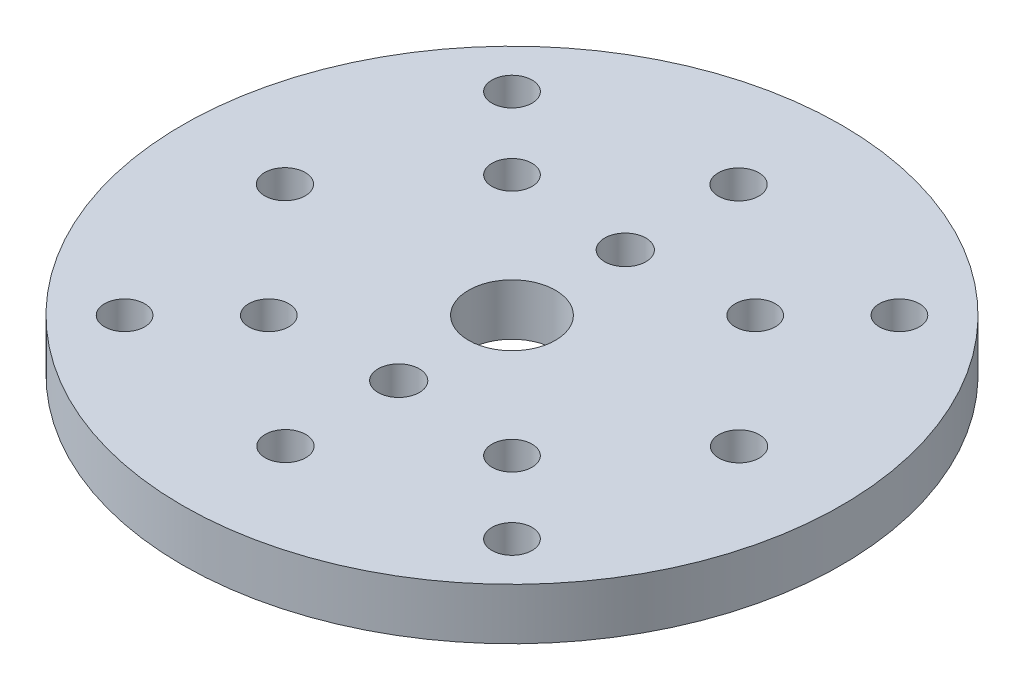
ISO-10303-21;
HEADER;
FILE_DESCRIPTION(('STEP AP214'),'2;1');
FILE_NAME('part.step','',(''),(''),'','','');
FILE_SCHEMA(('AUTOMOTIVE_DESIGN { 1 0 10303 214 1 1 1 1 }'));
ENDSEC;
DATA;
#1=APPLICATION_CONTEXT('core data for automotive mechanical design processes');
#2=APPLICATION_PROTOCOL_DEFINITION('international standard','automotive_design',2000,#1);
#3=PRODUCT_CONTEXT('',#1,'mechanical');
#4=PRODUCT('Part','Part','',(#3));
#5=PRODUCT_RELATED_PRODUCT_CATEGORY('part','',(#4));
#6=PRODUCT_DEFINITION_FORMATION('','',#4);
#7=PRODUCT_DEFINITION_CONTEXT('part definition',#1,'design');
#8=PRODUCT_DEFINITION('design','',#6,#7);
#9=PRODUCT_DEFINITION_SHAPE('','',#8);
#10=(LENGTH_UNIT() NAMED_UNIT(*) SI_UNIT(.MILLI.,.METRE.));
#11=(NAMED_UNIT(*) PLANE_ANGLE_UNIT() SI_UNIT($,.RADIAN.));
#12=(NAMED_UNIT(*) SI_UNIT($,.STERADIAN.) SOLID_ANGLE_UNIT());
#13=UNCERTAINTY_MEASURE_WITH_UNIT(LENGTH_MEASURE(1.E-05),#10,'distance_accuracy_value','');
#14=(GEOMETRIC_REPRESENTATION_CONTEXT(3) GLOBAL_UNCERTAINTY_ASSIGNED_CONTEXT((#13)) GLOBAL_UNIT_ASSIGNED_CONTEXT((#10,
#11,#12)) REPRESENTATION_CONTEXT('',''));
#15=CARTESIAN_POINT('',(0.,0.,0.));
#16=DIRECTION('',(0.,0.,1.));
#17=DIRECTION('',(1.,0.,0.));
#18=AXIS2_PLACEMENT_3D('',#15,#16,#17);
#19=CARTESIAN_POINT('',(0.,6.35,0.));
#20=DIRECTION('',(0.,1.,0.));
#21=DIRECTION('',(0.,0.,1.));
#22=AXIS2_PLACEMENT_3D('',#19,#20,#21);
#23=PLANE('',#22);
#24=CARTESIAN_POINT('',(-28.,6.35,0.));
#25=DIRECTION('',(0.,1.,0.));
#26=DIRECTION('',(0.,0.,-1.));
#27=AXIS2_PLACEMENT_3D('',#24,#25,#26);
#28=CIRCLE('',#27,2.5);
#29=CARTESIAN_POINT('',(-28.,6.35,-2.49999999999999));
#30=VERTEX_POINT('',#29);
#31=EDGE_CURVE('E124',#30,#30,#28,.T.);
#32=ORIENTED_EDGE('',*,*,#31,.F.);
#33=EDGE_LOOP('',(#32));
#34=FACE_BOUND('',#33,.T.);
#35=CARTESIAN_POINT('',(0.,6.35,-27.9397597429634));
#36=DIRECTION('',(0.,1.,0.));
#37=DIRECTION('',(0.,0.,-1.));
#38=AXIS2_PLACEMENT_3D('',#35,#36,#37);
#39=CIRCLE('',#38,2.5);
#40=CARTESIAN_POINT('',(0.,6.35,-30.4397597429634));
#41=VERTEX_POINT('',#40);
#42=EDGE_CURVE('E114',#41,#41,#39,.T.);
#43=ORIENTED_EDGE('',*,*,#42,.F.);
#44=EDGE_LOOP('',(#43));
#45=FACE_BOUND('',#44,.T.);
#46=CARTESIAN_POINT('',(-23.8874812820442,6.35,23.8874812820437));
#47=DIRECTION('',(0.,1.,0.));
#48=DIRECTION('',(0.,0.,1.));
#49=AXIS2_PLACEMENT_3D('',#46,#47,#48);
#50=CIRCLE('',#49,2.475);
#51=CARTESIAN_POINT('',(-23.8874812820442,6.35,26.3624812820437));
#52=VERTEX_POINT('',#51);
#53=EDGE_CURVE('E101',#52,#52,#50,.T.);
#54=ORIENTED_EDGE('',*,*,#53,.F.);
#55=EDGE_LOOP('',(#54));
#56=FACE_BOUND('',#55,.T.);
#57=CARTESIAN_POINT('',(14.9970277221855,6.35,-14.9970277221855));
#58=DIRECTION('',(0.,1.,0.));
#59=DIRECTION('',(0.,0.,1.));
#60=AXIS2_PLACEMENT_3D('',#57,#58,#59);
#61=CIRCLE('',#60,2.475);
#62=CARTESIAN_POINT('',(14.9970277221855,6.35,-12.5220277221855));
#63=VERTEX_POINT('',#62);
#64=EDGE_CURVE('E90',#63,#63,#61,.T.);
#65=ORIENTED_EDGE('',*,*,#64,.F.);
#66=EDGE_LOOP('',(#65));
#67=FACE_BOUND('',#66,.T.);
#68=CARTESIAN_POINT('',(-14.9970277221855,6.35,14.9970277221855));
#69=DIRECTION('',(0.,1.,0.));
#70=DIRECTION('',(0.,0.,1.));
#71=AXIS2_PLACEMENT_3D('',#68,#69,#70);
#72=CIRCLE('',#71,2.475);
#73=CARTESIAN_POINT('',(-14.9970277221855,6.35,17.4720277221855));
#74=VERTEX_POINT('',#73);
#75=EDGE_CURVE('E79',#74,#74,#72,.T.);
#76=ORIENTED_EDGE('',*,*,#75,.F.);
#77=EDGE_LOOP('',(#76));
#78=FACE_BOUND('',#77,.T.);
#79=CARTESIAN_POINT('',(-23.887481282044,6.35,-23.8874812820439));
#80=DIRECTION('',(0.,1.,0.));
#81=DIRECTION('',(0.,0.,1.));
#82=AXIS2_PLACEMENT_3D('',#79,#80,#81);
#83=CIRCLE('',#82,2.475);
#84=CARTESIAN_POINT('',(-23.887481282044,6.35,-21.4124812820439));
#85=VERTEX_POINT('',#84);
#86=EDGE_CURVE('E61',#85,#85,#83,.T.);
#87=ORIENTED_EDGE('',*,*,#86,.F.);
#88=EDGE_LOOP('',(#87));
#89=FACE_BOUND('',#88,.T.);
#90=CARTESIAN_POINT('',(0.,6.35,-13.97));
#91=DIRECTION('',(0.,1.,0.));
#92=DIRECTION('',(0.,0.,1.));
#93=AXIS2_PLACEMENT_3D('',#90,#91,#92);
#94=CIRCLE('',#93,2.53999999999997);
#95=CARTESIAN_POINT('',(0.,6.35,-11.43));
#96=VERTEX_POINT('',#95);
#97=EDGE_CURVE('E52',#96,#96,#94,.T.);
#98=ORIENTED_EDGE('',*,*,#97,.F.);
#99=EDGE_LOOP('',(#98));
#100=FACE_BOUND('',#99,.T.);
#101=CARTESIAN_POINT('',(0.,6.35,0.));
#102=DIRECTION('',(0.,1.,0.));
#103=DIRECTION('',(0.,0.,1.));
#104=AXIS2_PLACEMENT_3D('',#101,#102,#103);
#105=CIRCLE('',#104,40.64);
#106=CARTESIAN_POINT('',(0.,6.35,40.64));
#107=VERTEX_POINT('',#106);
#108=EDGE_CURVE('E10',#107,#107,#105,.T.);
#109=ORIENTED_EDGE('',*,*,#108,.T.);
#110=EDGE_LOOP('',(#109));
#111=FACE_BOUND('',#110,.T.);
#112=CARTESIAN_POINT('',(0.,6.35,0.));
#113=DIRECTION('',(0.,1.,0.));
#114=DIRECTION('',(0.,0.,1.));
#115=AXIS2_PLACEMENT_3D('',#112,#113,#114);
#116=CIRCLE('',#115,5.3578125);
#117=CARTESIAN_POINT('',(0.,6.35,5.3578125));
#118=VERTEX_POINT('',#117);
#119=EDGE_CURVE('E48',#118,#118,#116,.T.);
#120=ORIENTED_EDGE('',*,*,#119,.F.);
#121=EDGE_LOOP('',(#120));
#122=FACE_BOUND('',#121,.T.);
#123=CARTESIAN_POINT('',(0.,6.35,13.97));
#124=DIRECTION('',(0.,1.,0.));
#125=DIRECTION('',(0.,0.,1.));
#126=AXIS2_PLACEMENT_3D('',#123,#124,#125);
#127=CIRCLE('',#126,2.53999999999996);
#128=CARTESIAN_POINT('',(0.,6.35,16.51));
#129=VERTEX_POINT('',#128);
#130=EDGE_CURVE('E56',#129,#129,#127,.T.);
#131=ORIENTED_EDGE('',*,*,#130,.F.);
#132=EDGE_LOOP('',(#131));
#133=FACE_BOUND('',#132,.T.);
#134=CARTESIAN_POINT('',(-14.9970277221855,6.35,-14.9970277221855));
#135=DIRECTION('',(0.,1.,0.));
#136=DIRECTION('',(0.,0.,1.));
#137=AXIS2_PLACEMENT_3D('',#134,#135,#136);
#138=CIRCLE('',#137,2.475);
#139=CARTESIAN_POINT('',(-14.9970277221855,6.35,-12.5220277221855));
#140=VERTEX_POINT('',#139);
#141=EDGE_CURVE('E72',#140,#140,#138,.T.);
#142=ORIENTED_EDGE('',*,*,#141,.F.);
#143=EDGE_LOOP('',(#142));
#144=FACE_BOUND('',#143,.T.);
#145=CARTESIAN_POINT('',(14.9970277221855,6.35,14.9970277221855));
#146=DIRECTION('',(0.,1.,0.));
#147=DIRECTION('',(0.,0.,1.));
#148=AXIS2_PLACEMENT_3D('',#145,#146,#147);
#149=CIRCLE('',#148,2.475);
#150=CARTESIAN_POINT('',(14.9970277221855,6.35,17.4720277221855));
#151=VERTEX_POINT('',#150);
#152=EDGE_CURVE('E82',#151,#151,#149,.T.);
#153=ORIENTED_EDGE('',*,*,#152,.F.);
#154=EDGE_LOOP('',(#153));
#155=FACE_BOUND('',#154,.T.);
#156=CARTESIAN_POINT('',(23.887481282044,6.35,-23.8874812820439));
#157=DIRECTION('',(0.,1.,0.));
#158=DIRECTION('',(0.,0.,1.));
#159=AXIS2_PLACEMENT_3D('',#156,#157,#158);
#160=CIRCLE('',#159,2.475);
#161=CARTESIAN_POINT('',(23.887481282044,6.35,-21.4124812820439));
#162=VERTEX_POINT('',#161);
#163=EDGE_CURVE('E92',#162,#162,#160,.T.);
#164=ORIENTED_EDGE('',*,*,#163,.F.);
#165=EDGE_LOOP('',(#164));
#166=FACE_BOUND('',#165,.T.);
#167=CARTESIAN_POINT('',(23.8874812820438,6.35,23.8874812820441));
#168=DIRECTION('',(0.,1.,0.));
#169=DIRECTION('',(0.,0.,1.));
#170=AXIS2_PLACEMENT_3D('',#167,#168,#169);
#171=CIRCLE('',#170,2.475);
#172=CARTESIAN_POINT('',(23.8874812820438,6.35,26.3624812820441));
#173=VERTEX_POINT('',#172);
#174=EDGE_CURVE('E110',#173,#173,#171,.T.);
#175=ORIENTED_EDGE('',*,*,#174,.F.);
#176=EDGE_LOOP('',(#175));
#177=FACE_BOUND('',#176,.T.);
#178=CARTESIAN_POINT('',(28.,6.35,0.));
#179=DIRECTION('',(0.,1.,0.));
#180=DIRECTION('',(0.,0.,-1.));
#181=AXIS2_PLACEMENT_3D('',#178,#179,#180);
#182=CIRCLE('',#181,2.5);
#183=CARTESIAN_POINT('',(28.,6.35,-2.5));
#184=VERTEX_POINT('',#183);
#185=EDGE_CURVE('E120',#184,#184,#182,.T.);
#186=ORIENTED_EDGE('',*,*,#185,.F.);
#187=EDGE_LOOP('',(#186));
#188=FACE_BOUND('',#187,.T.);
#189=CARTESIAN_POINT('',(0.,6.35,27.9397597429634));
#190=DIRECTION('',(0.,1.,0.));
#191=DIRECTION('',(0.,0.,-1.));
#192=AXIS2_PLACEMENT_3D('',#189,#190,#191);
#193=CIRCLE('',#192,2.5);
#194=CARTESIAN_POINT('',(0.,6.35,25.4397597429634));
#195=VERTEX_POINT('',#194);
#196=EDGE_CURVE('E133',#195,#195,#193,.T.);
#197=ORIENTED_EDGE('',*,*,#196,.F.);
#198=EDGE_LOOP('',(#197));
#199=FACE_BOUND('',#198,.T.);
#200=ADVANCED_FACE('F40',(#34,#45,#56,#67,#78,#89,#100,#111,#122,#133,#144,#155,#166,#177,#188,
#199),#23,.T.);
#201=CARTESIAN_POINT('',(0.,0.,0.));
#202=DIRECTION('',(0.,1.,0.));
#203=DIRECTION('',(0.,0.,1.));
#204=AXIS2_PLACEMENT_3D('',#201,#202,#203);
#205=PLANE('',#204);
#206=CARTESIAN_POINT('',(0.,0.,0.));
#207=DIRECTION('',(0.,1.,0.));
#208=DIRECTION('',(0.,0.,1.));
#209=AXIS2_PLACEMENT_3D('',#206,#207,#208);
#210=CIRCLE('',#209,40.64);
#211=CARTESIAN_POINT('',(0.,0.,40.64));
#212=VERTEX_POINT('',#211);
#213=EDGE_CURVE('E41',#212,#212,#210,.T.);
#214=ORIENTED_EDGE('',*,*,#213,.F.);
#215=EDGE_LOOP('',(#214));
#216=FACE_BOUND('',#215,.T.);
#217=CARTESIAN_POINT('',(0.,0.,0.));
#218=DIRECTION('',(0.,1.,0.));
#219=DIRECTION('',(0.,0.,1.));
#220=AXIS2_PLACEMENT_3D('',#217,#218,#219);
#221=CIRCLE('',#220,5.3578125);
#222=CARTESIAN_POINT('',(0.,0.,5.3578125));
#223=VERTEX_POINT('',#222);
#224=EDGE_CURVE('E49',#223,#223,#221,.T.);
#225=ORIENTED_EDGE('',*,*,#224,.T.);
#226=EDGE_LOOP('',(#225));
#227=FACE_BOUND('',#226,.T.);
#228=CARTESIAN_POINT('',(0.,0.,-13.97));
#229=DIRECTION('',(0.,1.,0.));
#230=DIRECTION('',(0.,0.,1.));
#231=AXIS2_PLACEMENT_3D('',#228,#229,#230);
#232=CIRCLE('',#231,2.53999999999997);
#233=CARTESIAN_POINT('',(0.,0.,-11.43));
#234=VERTEX_POINT('',#233);
#235=EDGE_CURVE('E57',#234,#234,#232,.T.);
#236=ORIENTED_EDGE('',*,*,#235,.T.);
#237=EDGE_LOOP('',(#236));
#238=FACE_BOUND('',#237,.T.);
#239=CARTESIAN_POINT('',(0.,0.,13.97));
#240=DIRECTION('',(0.,1.,0.));
#241=DIRECTION('',(0.,0.,1.));
#242=AXIS2_PLACEMENT_3D('',#239,#240,#241);
#243=CIRCLE('',#242,2.53999999999996);
#244=CARTESIAN_POINT('',(0.,0.,16.51));
#245=VERTEX_POINT('',#244);
#246=EDGE_CURVE('E64',#245,#245,#243,.T.);
#247=ORIENTED_EDGE('',*,*,#246,.T.);
#248=EDGE_LOOP('',(#247));
#249=FACE_BOUND('',#248,.T.);
#250=CARTESIAN_POINT('',(-23.887481282044,0.,-23.8874812820439));
#251=DIRECTION('',(0.,1.,0.));
#252=DIRECTION('',(0.,0.,1.));
#253=AXIS2_PLACEMENT_3D('',#250,#251,#252);
#254=CIRCLE('',#253,2.475);
#255=CARTESIAN_POINT('',(-23.887481282044,0.,-21.4124812820439));
#256=VERTEX_POINT('',#255);
#257=EDGE_CURVE('E67',#256,#256,#254,.T.);
#258=ORIENTED_EDGE('',*,*,#257,.T.);
#259=EDGE_LOOP('',(#258));
#260=FACE_BOUND('',#259,.T.);
#261=CARTESIAN_POINT('',(-14.9970277221855,0.,-14.9970277221855));
#262=DIRECTION('',(0.,1.,0.));
#263=DIRECTION('',(0.,0.,1.));
#264=AXIS2_PLACEMENT_3D('',#261,#262,#263);
#265=CIRCLE('',#264,2.475);
#266=CARTESIAN_POINT('',(-14.9970277221855,0.,-12.5220277221855));
#267=VERTEX_POINT('',#266);
#268=EDGE_CURVE('E74',#267,#267,#265,.T.);
#269=ORIENTED_EDGE('',*,*,#268,.T.);
#270=EDGE_LOOP('',(#269));
#271=FACE_BOUND('',#270,.T.);
#272=CARTESIAN_POINT('',(-14.9970277221855,0.,14.9970277221855));
#273=DIRECTION('',(0.,1.,0.));
#274=DIRECTION('',(0.,0.,1.));
#275=AXIS2_PLACEMENT_3D('',#272,#273,#274);
#276=CIRCLE('',#275,2.475);
#277=CARTESIAN_POINT('',(-14.9970277221855,0.,17.4720277221855));
#278=VERTEX_POINT('',#277);
#279=EDGE_CURVE('E76',#278,#278,#276,.T.);
#280=ORIENTED_EDGE('',*,*,#279,.T.);
#281=EDGE_LOOP('',(#280));
#282=FACE_BOUND('',#281,.T.);
#283=CARTESIAN_POINT('',(14.9970277221855,0.,14.9970277221855));
#284=DIRECTION('',(0.,1.,0.));
#285=DIRECTION('',(0.,0.,1.));
#286=AXIS2_PLACEMENT_3D('',#283,#284,#285);
#287=CIRCLE('',#286,2.475);
#288=CARTESIAN_POINT('',(14.9970277221855,0.,17.4720277221855));
#289=VERTEX_POINT('',#288);
#290=EDGE_CURVE('E88',#289,#289,#287,.T.);
#291=ORIENTED_EDGE('',*,*,#290,.T.);
#292=EDGE_LOOP('',(#291));
#293=FACE_BOUND('',#292,.T.);
#294=CARTESIAN_POINT('',(14.9970277221855,0.,-14.9970277221855));
#295=DIRECTION('',(0.,1.,0.));
#296=DIRECTION('',(0.,0.,1.));
#297=AXIS2_PLACEMENT_3D('',#294,#295,#296);
#298=CIRCLE('',#297,2.475);
#299=CARTESIAN_POINT('',(14.9970277221855,0.,-12.5220277221855));
#300=VERTEX_POINT('',#299);
#301=EDGE_CURVE('E95',#300,#300,#298,.T.);
#302=ORIENTED_EDGE('',*,*,#301,.T.);
#303=EDGE_LOOP('',(#302));
#304=FACE_BOUND('',#303,.T.);
#305=CARTESIAN_POINT('',(23.887481282044,0.,-23.8874812820439));
#306=DIRECTION('',(0.,1.,0.));
#307=DIRECTION('',(0.,0.,1.));
#308=AXIS2_PLACEMENT_3D('',#305,#306,#307);
#309=CIRCLE('',#308,2.475);
#310=CARTESIAN_POINT('',(23.887481282044,0.,-21.4124812820439));
#311=VERTEX_POINT('',#310);
#312=EDGE_CURVE('E98',#311,#311,#309,.T.);
#313=ORIENTED_EDGE('',*,*,#312,.T.);
#314=EDGE_LOOP('',(#313));
#315=FACE_BOUND('',#314,.T.);
#316=CARTESIAN_POINT('',(-23.8874812820442,0.,23.8874812820437));
#317=DIRECTION('',(0.,1.,0.));
#318=DIRECTION('',(0.,0.,1.));
#319=AXIS2_PLACEMENT_3D('',#316,#317,#318);
#320=CIRCLE('',#319,2.475);
#321=CARTESIAN_POINT('',(-23.8874812820442,0.,26.3624812820437));
#322=VERTEX_POINT('',#321);
#323=EDGE_CURVE('E102',#322,#322,#320,.T.);
#324=ORIENTED_EDGE('',*,*,#323,.T.);
#325=EDGE_LOOP('',(#324));
#326=FACE_BOUND('',#325,.T.);
#327=CARTESIAN_POINT('',(23.8874812820438,0.,23.8874812820441));
#328=DIRECTION('',(0.,1.,0.));
#329=DIRECTION('',(0.,0.,1.));
#330=AXIS2_PLACEMENT_3D('',#327,#328,#329);
#331=CIRCLE('',#330,2.475);
#332=CARTESIAN_POINT('',(23.8874812820438,0.,26.3624812820441));
#333=VERTEX_POINT('',#332);
#334=EDGE_CURVE('E109',#333,#333,#331,.T.);
#335=ORIENTED_EDGE('',*,*,#334,.T.);
#336=EDGE_LOOP('',(#335));
#337=FACE_BOUND('',#336,.T.);
#338=CARTESIAN_POINT('',(0.,0.,-27.9397597429634));
#339=DIRECTION('',(0.,1.,0.));
#340=DIRECTION('',(0.,0.,-1.));
#341=AXIS2_PLACEMENT_3D('',#338,#339,#340);
#342=CIRCLE('',#341,2.5);
#343=CARTESIAN_POINT('',(0.,0.,-30.4397597429634));
#344=VERTEX_POINT('',#343);
#345=EDGE_CURVE('E118',#344,#344,#342,.T.);
#346=ORIENTED_EDGE('',*,*,#345,.T.);
#347=EDGE_LOOP('',(#346));
#348=FACE_BOUND('',#347,.T.);
#349=CARTESIAN_POINT('',(28.,0.,0.));
#350=DIRECTION('',(0.,1.,0.));
#351=DIRECTION('',(0.,0.,-1.));
#352=AXIS2_PLACEMENT_3D('',#349,#350,#351);
#353=CIRCLE('',#352,2.5);
#354=CARTESIAN_POINT('',(28.,0.,-2.5));
#355=VERTEX_POINT('',#354);
#356=EDGE_CURVE('E125',#355,#355,#353,.T.);
#357=ORIENTED_EDGE('',*,*,#356,.T.);
#358=EDGE_LOOP('',(#357));
#359=FACE_BOUND('',#358,.T.);
#360=CARTESIAN_POINT('',(-28.,0.,0.));
#361=DIRECTION('',(0.,1.,0.));
#362=DIRECTION('',(0.,0.,-1.));
#363=AXIS2_PLACEMENT_3D('',#360,#361,#362);
#364=CIRCLE('',#363,2.5);
#365=CARTESIAN_POINT('',(-28.,0.,-2.49999999999999));
#366=VERTEX_POINT('',#365);
#367=EDGE_CURVE('E126',#366,#366,#364,.T.);
#368=ORIENTED_EDGE('',*,*,#367,.T.);
#369=EDGE_LOOP('',(#368));
#370=FACE_BOUND('',#369,.T.);
#371=CARTESIAN_POINT('',(0.,0.,27.9397597429634));
#372=DIRECTION('',(0.,1.,0.));
#373=DIRECTION('',(0.,0.,-1.));
#374=AXIS2_PLACEMENT_3D('',#371,#372,#373);
#375=CIRCLE('',#374,2.5);
#376=CARTESIAN_POINT('',(0.,0.,25.4397597429634));
#377=VERTEX_POINT('',#376);
#378=EDGE_CURVE('E135',#377,#377,#375,.T.);
#379=ORIENTED_EDGE('',*,*,#378,.T.);
#380=EDGE_LOOP('',(#379));
#381=FACE_BOUND('',#380,.T.);
#382=ADVANCED_FACE('F145',(#216,#227,#238,#249,#260,#271,#282,#293,#304,#315,#326,#337,#348,
#359,#370,#381),#205,.F.);
#383=CARTESIAN_POINT('',(0.,6.35,0.));
#384=DIRECTION('',(0.,-1.,0.));
#385=DIRECTION('',(0.,0.,-1.));
#386=AXIS2_PLACEMENT_3D('',#383,#384,#385);
#387=CYLINDRICAL_SURFACE('',#386,40.64);
#388=ORIENTED_EDGE('',*,*,#108,.F.);
#389=EDGE_LOOP('',(#388));
#390=FACE_BOUND('',#389,.T.);
#391=ORIENTED_EDGE('',*,*,#213,.T.);
#392=EDGE_LOOP('',(#391));
#393=FACE_BOUND('',#392,.T.);
#394=ADVANCED_FACE('F39',(#390,#393),#387,.T.);
#395=CARTESIAN_POINT('',(0.,6.35,0.));
#396=DIRECTION('',(0.,-1.,0.));
#397=DIRECTION('',(0.,0.,-1.));
#398=AXIS2_PLACEMENT_3D('',#395,#396,#397);
#399=CYLINDRICAL_SURFACE('',#398,5.3578125);
#400=ORIENTED_EDGE('',*,*,#119,.T.);
#401=EDGE_LOOP('',(#400));
#402=FACE_BOUND('',#401,.T.);
#403=ORIENTED_EDGE('',*,*,#224,.F.);
#404=EDGE_LOOP('',(#403));
#405=FACE_BOUND('',#404,.T.);
#406=ADVANCED_FACE('F152',(#402,#405),#399,.F.);
#407=CARTESIAN_POINT('',(0.,6.35,-13.97));
#408=DIRECTION('',(0.,-1.,0.));
#409=DIRECTION('',(0.,0.,-1.));
#410=AXIS2_PLACEMENT_3D('',#407,#408,#409);
#411=CYLINDRICAL_SURFACE('',#410,2.53999999999997);
#412=ORIENTED_EDGE('',*,*,#97,.T.);
#413=EDGE_LOOP('',(#412));
#414=FACE_BOUND('',#413,.T.);
#415=ORIENTED_EDGE('',*,*,#235,.F.);
#416=EDGE_LOOP('',(#415));
#417=FACE_BOUND('',#416,.T.);
#418=ADVANCED_FACE('F160',(#414,#417),#411,.F.);
#419=CARTESIAN_POINT('',(0.,6.35,13.97));
#420=DIRECTION('',(0.,-1.,0.));
#421=DIRECTION('',(0.,0.,-1.));
#422=AXIS2_PLACEMENT_3D('',#419,#420,#421);
#423=CYLINDRICAL_SURFACE('',#422,2.53999999999996);
#424=ORIENTED_EDGE('',*,*,#130,.T.);
#425=EDGE_LOOP('',(#424));
#426=FACE_BOUND('',#425,.T.);
#427=ORIENTED_EDGE('',*,*,#246,.F.);
#428=EDGE_LOOP('',(#427));
#429=FACE_BOUND('',#428,.T.);
#430=ADVANCED_FACE('F161',(#426,#429),#423,.F.);
#431=CARTESIAN_POINT('',(-23.887481282044,6.35,-23.8874812820439));
#432=DIRECTION('',(0.,-1.,0.));
#433=DIRECTION('',(0.,0.,-1.));
#434=AXIS2_PLACEMENT_3D('',#431,#432,#433);
#435=CYLINDRICAL_SURFACE('',#434,2.475);
#436=ORIENTED_EDGE('',*,*,#86,.T.);
#437=EDGE_LOOP('',(#436));
#438=FACE_BOUND('',#437,.T.);
#439=ORIENTED_EDGE('',*,*,#257,.F.);
#440=EDGE_LOOP('',(#439));
#441=FACE_BOUND('',#440,.T.);
#442=ADVANCED_FACE('F164',(#438,#441),#435,.F.);
#443=CARTESIAN_POINT('',(-14.9970277221855,6.35,-14.9970277221855));
#444=DIRECTION('',(0.,-1.,0.));
#445=DIRECTION('',(0.,0.,-1.));
#446=AXIS2_PLACEMENT_3D('',#443,#444,#445);
#447=CYLINDRICAL_SURFACE('',#446,2.475);
#448=ORIENTED_EDGE('',*,*,#141,.T.);
#449=EDGE_LOOP('',(#448));
#450=FACE_BOUND('',#449,.T.);
#451=ORIENTED_EDGE('',*,*,#268,.F.);
#452=EDGE_LOOP('',(#451));
#453=FACE_BOUND('',#452,.T.);
#454=ADVANCED_FACE('F166',(#450,#453),#447,.F.);
#455=CARTESIAN_POINT('',(-14.9970277221855,6.35,14.9970277221855));
#456=DIRECTION('',(0.,-1.,0.));
#457=DIRECTION('',(0.,0.,-1.));
#458=AXIS2_PLACEMENT_3D('',#455,#456,#457);
#459=CYLINDRICAL_SURFACE('',#458,2.475);
#460=ORIENTED_EDGE('',*,*,#75,.T.);
#461=EDGE_LOOP('',(#460));
#462=FACE_BOUND('',#461,.T.);
#463=ORIENTED_EDGE('',*,*,#279,.F.);
#464=EDGE_LOOP('',(#463));
#465=FACE_BOUND('',#464,.T.);
#466=ADVANCED_FACE('F172',(#462,#465),#459,.F.);
#467=CARTESIAN_POINT('',(14.9970277221855,6.35,14.9970277221855));
#468=DIRECTION('',(0.,-1.,0.));
#469=DIRECTION('',(0.,0.,-1.));
#470=AXIS2_PLACEMENT_3D('',#467,#468,#469);
#471=CYLINDRICAL_SURFACE('',#470,2.475);
#472=ORIENTED_EDGE('',*,*,#152,.T.);
#473=EDGE_LOOP('',(#472));
#474=FACE_BOUND('',#473,.T.);
#475=ORIENTED_EDGE('',*,*,#290,.F.);
#476=EDGE_LOOP('',(#475));
#477=FACE_BOUND('',#476,.T.);
#478=ADVANCED_FACE('F180',(#474,#477),#471,.F.);
#479=CARTESIAN_POINT('',(14.9970277221855,6.35,-14.9970277221855));
#480=DIRECTION('',(0.,-1.,0.));
#481=DIRECTION('',(0.,0.,-1.));
#482=AXIS2_PLACEMENT_3D('',#479,#480,#481);
#483=CYLINDRICAL_SURFACE('',#482,2.475);
#484=ORIENTED_EDGE('',*,*,#64,.T.);
#485=EDGE_LOOP('',(#484));
#486=FACE_BOUND('',#485,.T.);
#487=ORIENTED_EDGE('',*,*,#301,.F.);
#488=EDGE_LOOP('',(#487));
#489=FACE_BOUND('',#488,.T.);
#490=ADVANCED_FACE('F182',(#486,#489),#483,.F.);
#491=CARTESIAN_POINT('',(23.887481282044,6.35,-23.8874812820439));
#492=DIRECTION('',(0.,-1.,0.));
#493=DIRECTION('',(0.,0.,-1.));
#494=AXIS2_PLACEMENT_3D('',#491,#492,#493);
#495=CYLINDRICAL_SURFACE('',#494,2.475);
#496=ORIENTED_EDGE('',*,*,#163,.T.);
#497=EDGE_LOOP('',(#496));
#498=FACE_BOUND('',#497,.T.);
#499=ORIENTED_EDGE('',*,*,#312,.F.);
#500=EDGE_LOOP('',(#499));
#501=FACE_BOUND('',#500,.T.);
#502=ADVANCED_FACE('F183',(#498,#501),#495,.F.);
#503=CARTESIAN_POINT('',(-23.8874812820442,6.35,23.8874812820437));
#504=DIRECTION('',(0.,-1.,0.));
#505=DIRECTION('',(0.,0.,-1.));
#506=AXIS2_PLACEMENT_3D('',#503,#504,#505);
#507=CYLINDRICAL_SURFACE('',#506,2.475);
#508=ORIENTED_EDGE('',*,*,#53,.T.);
#509=EDGE_LOOP('',(#508));
#510=FACE_BOUND('',#509,.T.);
#511=ORIENTED_EDGE('',*,*,#323,.F.);
#512=EDGE_LOOP('',(#511));
#513=FACE_BOUND('',#512,.T.);
#514=ADVANCED_FACE('F190',(#510,#513),#507,.F.);
#515=CARTESIAN_POINT('',(23.8874812820438,6.35,23.8874812820441));
#516=DIRECTION('',(0.,-1.,0.));
#517=DIRECTION('',(0.,0.,-1.));
#518=AXIS2_PLACEMENT_3D('',#515,#516,#517);
#519=CYLINDRICAL_SURFACE('',#518,2.475);
#520=ORIENTED_EDGE('',*,*,#174,.T.);
#521=EDGE_LOOP('',(#520));
#522=FACE_BOUND('',#521,.T.);
#523=ORIENTED_EDGE('',*,*,#334,.F.);
#524=EDGE_LOOP('',(#523));
#525=FACE_BOUND('',#524,.T.);
#526=ADVANCED_FACE('F192',(#522,#525),#519,.F.);
#527=CARTESIAN_POINT('',(0.,6.35,-27.9397597429634));
#528=DIRECTION('',(0.,-1.,0.));
#529=DIRECTION('',(0.,0.,-1.));
#530=AXIS2_PLACEMENT_3D('',#527,#528,#529);
#531=CYLINDRICAL_SURFACE('',#530,2.5);
#532=ORIENTED_EDGE('',*,*,#42,.T.);
#533=EDGE_LOOP('',(#532));
#534=FACE_BOUND('',#533,.T.);
#535=ORIENTED_EDGE('',*,*,#345,.F.);
#536=EDGE_LOOP('',(#535));
#537=FACE_BOUND('',#536,.T.);
#538=ADVANCED_FACE('F197',(#534,#537),#531,.F.);
#539=CARTESIAN_POINT('',(28.,6.35,0.));
#540=DIRECTION('',(0.,-1.,0.));
#541=DIRECTION('',(0.,0.,-1.));
#542=AXIS2_PLACEMENT_3D('',#539,#540,#541);
#543=CYLINDRICAL_SURFACE('',#542,2.5);
#544=ORIENTED_EDGE('',*,*,#185,.T.);
#545=EDGE_LOOP('',(#544));
#546=FACE_BOUND('',#545,.T.);
#547=ORIENTED_EDGE('',*,*,#356,.F.);
#548=EDGE_LOOP('',(#547));
#549=FACE_BOUND('',#548,.T.);
#550=ADVANCED_FACE('F203',(#546,#549),#543,.F.);
#551=CARTESIAN_POINT('',(-28.,6.35,0.));
#552=DIRECTION('',(0.,-1.,0.));
#553=DIRECTION('',(0.,0.,-1.));
#554=AXIS2_PLACEMENT_3D('',#551,#552,#553);
#555=CYLINDRICAL_SURFACE('',#554,2.5);
#556=ORIENTED_EDGE('',*,*,#31,.T.);
#557=EDGE_LOOP('',(#556));
#558=FACE_BOUND('',#557,.T.);
#559=ORIENTED_EDGE('',*,*,#367,.F.);
#560=EDGE_LOOP('',(#559));
#561=FACE_BOUND('',#560,.T.);
#562=ADVANCED_FACE('F202',(#558,#561),#555,.F.);
#563=CARTESIAN_POINT('',(0.,6.35,27.9397597429634));
#564=DIRECTION('',(0.,-1.,0.));
#565=DIRECTION('',(0.,0.,-1.));
#566=AXIS2_PLACEMENT_3D('',#563,#564,#565);
#567=CYLINDRICAL_SURFACE('',#566,2.5);
#568=ORIENTED_EDGE('',*,*,#196,.T.);
#569=EDGE_LOOP('',(#568));
#570=FACE_BOUND('',#569,.T.);
#571=ORIENTED_EDGE('',*,*,#378,.F.);
#572=EDGE_LOOP('',(#571));
#573=FACE_BOUND('',#572,.T.);
#574=ADVANCED_FACE('F139',(#570,#573),#567,.F.);
#575=CLOSED_SHELL('',(#200,#382,#394,#406,#418,#430,#442,#454,#466,#478,#490,#502,#514,#526,
#538,#550,#562,#574));
#576=MANIFOLD_SOLID_BREP('B2',#575);
#577=ADVANCED_BREP_SHAPE_REPRESENTATION('',(#18,#576),#14);
#578=SHAPE_DEFINITION_REPRESENTATION(#9,#577);
ENDSEC;
END-ISO-10303-21;
